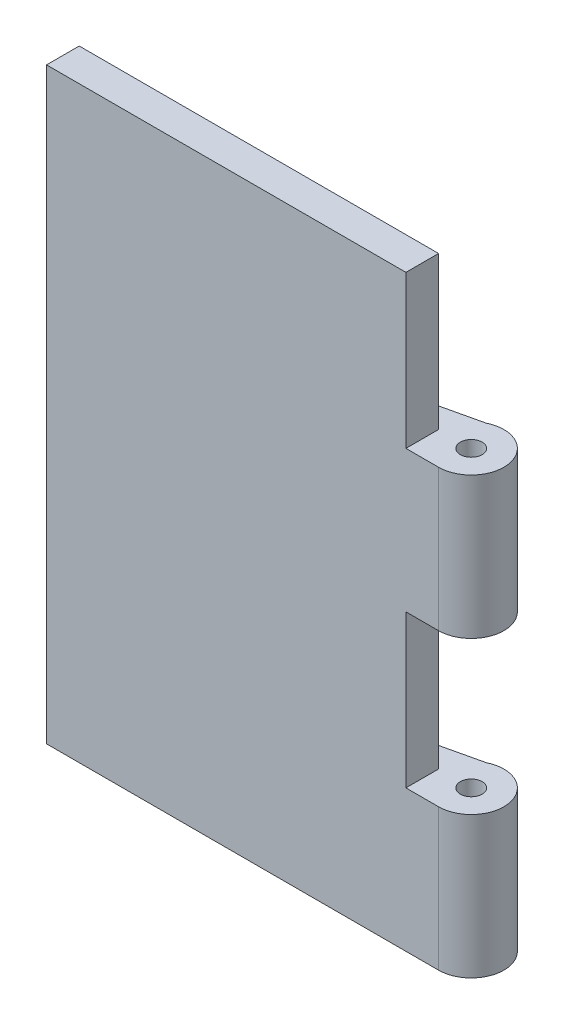
ISO-10303-21;
HEADER;
FILE_DESCRIPTION(('STEP AP214'),'2;1');
FILE_NAME('part.step','',(''),(''),'','','');
FILE_SCHEMA(('AUTOMOTIVE_DESIGN { 1 0 10303 214 1 1 1 1 }'));
ENDSEC;
DATA;
#1=APPLICATION_CONTEXT('core data for automotive mechanical design processes');
#2=APPLICATION_PROTOCOL_DEFINITION('international standard','automotive_design',2000,#1);
#3=PRODUCT_CONTEXT('',#1,'mechanical');
#4=PRODUCT('Part','Part','',(#3));
#5=PRODUCT_RELATED_PRODUCT_CATEGORY('part','',(#4));
#6=PRODUCT_DEFINITION_FORMATION('','',#4);
#7=PRODUCT_DEFINITION_CONTEXT('part definition',#1,'design');
#8=PRODUCT_DEFINITION('design','',#6,#7);
#9=PRODUCT_DEFINITION_SHAPE('','',#8);
#10=(LENGTH_UNIT() NAMED_UNIT(*) SI_UNIT(.MILLI.,.METRE.));
#11=(NAMED_UNIT(*) PLANE_ANGLE_UNIT() SI_UNIT($,.RADIAN.));
#12=(NAMED_UNIT(*) SI_UNIT($,.STERADIAN.) SOLID_ANGLE_UNIT());
#13=UNCERTAINTY_MEASURE_WITH_UNIT(LENGTH_MEASURE(1.E-05),#10,'distance_accuracy_value','');
#14=(GEOMETRIC_REPRESENTATION_CONTEXT(3) GLOBAL_UNCERTAINTY_ASSIGNED_CONTEXT((#13)) GLOBAL_UNIT_ASSIGNED_CONTEXT((#10,
#11,#12)) REPRESENTATION_CONTEXT('',''));
#15=CARTESIAN_POINT('',(0.,0.,0.));
#16=DIRECTION('',(0.,0.,1.));
#17=DIRECTION('',(1.,0.,0.));
#18=AXIS2_PLACEMENT_3D('',#15,#16,#17);
#19=CARTESIAN_POINT('',(-0.0379213483146069,6.5,-0.16432584269663));
#20=DIRECTION('',(0.224859506698759,0.,0.97439119569462));
#21=DIRECTION('',(0.97439119569462,0.,-0.224859506698759));
#22=AXIS2_PLACEMENT_3D('',#19,#20,#21);
#23=PLANE('',#22);
#24=DIRECTION('',(-0.97439119569462,0.,0.224859506698759));
#25=VECTOR('',#24,1.);
#26=CARTESIAN_POINT('',(-0.0379213483146069,0.,-0.16432584269663));
#27=LINE('',#26,#25);
#28=CARTESIAN_POINT('',(8.34269662921347,0.,-2.09831460674157));
#29=VERTEX_POINT('',#28);
#30=CARTESIAN_POINT('',(2.49999999999999,0.,-0.75));
#31=VERTEX_POINT('',#30);
#32=EDGE_CURVE('E160',#29,#31,#27,.T.);
#33=ORIENTED_EDGE('',*,*,#32,.T.);
#34=DIRECTION('',(0.,-1.,0.));
#35=VECTOR('',#34,1.);
#36=CARTESIAN_POINT('',(2.49999999999999,6.5,-0.75));
#37=LINE('',#36,#35);
#38=CARTESIAN_POINT('',(2.49999999999999,6.5,-0.75));
#39=VERTEX_POINT('',#38);
#40=EDGE_CURVE('E65',#39,#31,#37,.T.);
#41=ORIENTED_EDGE('',*,*,#40,.F.);
#42=DIRECTION('',(-0.97439119569462,0.,0.224859506698759));
#43=VECTOR('',#42,1.);
#44=CARTESIAN_POINT('',(-0.0379213483146069,6.5,-0.16432584269663));
#45=LINE('',#44,#43);
#46=CARTESIAN_POINT('',(8.34269662921347,6.5,-2.09831460674157));
#47=VERTEX_POINT('',#46);
#48=EDGE_CURVE('E241',#47,#39,#45,.T.);
#49=ORIENTED_EDGE('',*,*,#48,.F.);
#50=DIRECTION('',(0.,-1.,0.));
#51=VECTOR('',#50,1.);
#52=CARTESIAN_POINT('',(8.34269662921347,6.5,-2.09831460674157));
#53=LINE('',#52,#51);
#54=EDGE_CURVE('E12',#47,#29,#53,.T.);
#55=ORIENTED_EDGE('',*,*,#54,.T.);
#56=EDGE_LOOP('',(#33,#41,#49,#55));
#57=FACE_BOUND('',#56,.T.);
#58=ADVANCED_FACE('F56',(#57),#23,.F.);
#59=CARTESIAN_POINT('',(0.,6.5,-0.749999999999999));
#60=DIRECTION('',(0.,0.,1.));
#61=DIRECTION('',(1.,0.,0.));
#62=AXIS2_PLACEMENT_3D('',#59,#60,#61);
#63=PLANE('',#62);
#64=DIRECTION('',(-1.,0.,0.));
#65=VECTOR('',#64,1.);
#66=CARTESIAN_POINT('',(0.,0.,-0.749999999999999));
#67=LINE('',#66,#65);
#68=CARTESIAN_POINT('',(-9.00000000000001,0.,-0.749999999999997));
#69=VERTEX_POINT('',#68);
#70=EDGE_CURVE('E149',#31,#69,#67,.T.);
#71=ORIENTED_EDGE('',*,*,#70,.T.);
#72=DIRECTION('',(0.,-1.,0.));
#73=VECTOR('',#72,1.);
#74=CARTESIAN_POINT('',(-9.00000000000001,27.,-0.749999999999997));
#75=LINE('',#74,#73);
#76=CARTESIAN_POINT('',(-9.00000000000001,27.,-0.749999999999997));
#77=VERTEX_POINT('',#76);
#78=EDGE_CURVE('E154',#77,#69,#75,.T.);
#79=ORIENTED_EDGE('',*,*,#78,.F.);
#80=DIRECTION('',(-1.,0.,0.));
#81=VECTOR('',#80,1.);
#82=CARTESIAN_POINT('',(7.50000000000001,27.,-0.749999999999997));
#83=LINE('',#82,#81);
#84=CARTESIAN_POINT('',(7.50000000000001,27.,-0.749999999999997));
#85=VERTEX_POINT('',#84);
#86=EDGE_CURVE('E194',#85,#77,#83,.T.);
#87=ORIENTED_EDGE('',*,*,#86,.F.);
#88=DIRECTION('',(0.,-1.,0.));
#89=VECTOR('',#88,1.);
#90=CARTESIAN_POINT('',(7.50000000000001,27.,-0.749999999999997));
#91=LINE('',#90,#89);
#92=CARTESIAN_POINT('',(7.50000000000001,20.,-0.749999999999997));
#93=VERTEX_POINT('',#92);
#94=EDGE_CURVE('E196',#85,#93,#91,.T.);
#95=ORIENTED_EDGE('',*,*,#94,.T.);
#96=DIRECTION('',(-1.,0.,0.));
#97=VECTOR('',#96,1.);
#98=CARTESIAN_POINT('',(7.50000000000001,20.,-0.749999999999997));
#99=LINE('',#98,#97);
#100=CARTESIAN_POINT('',(2.5,20.,-0.749999999999997));
#101=VERTEX_POINT('',#100);
#102=EDGE_CURVE('E192',#93,#101,#99,.T.);
#103=ORIENTED_EDGE('',*,*,#102,.T.);
#104=DIRECTION('',(0.,-1.,0.));
#105=VECTOR('',#104,1.);
#106=CARTESIAN_POINT('',(2.5,20.,-0.749999999999997));
#107=LINE('',#106,#105);
#108=CARTESIAN_POINT('',(2.50000000000005,13.5,-0.750000000000003));
#109=VERTEX_POINT('',#108);
#110=EDGE_CURVE('E214',#101,#109,#107,.T.);
#111=ORIENTED_EDGE('',*,*,#110,.T.);
#112=DIRECTION('',(-1.,0.,0.));
#113=VECTOR('',#112,1.);
#114=CARTESIAN_POINT('',(7.50000000000001,13.5,-0.749999999999997));
#115=LINE('',#114,#113);
#116=CARTESIAN_POINT('',(7.50000000000001,13.5,-0.749999999999997));
#117=VERTEX_POINT('',#116);
#118=EDGE_CURVE('E81',#117,#109,#115,.T.);
#119=ORIENTED_EDGE('',*,*,#118,.F.);
#120=DIRECTION('',(0.,-1.,0.));
#121=VECTOR('',#120,1.);
#122=CARTESIAN_POINT('',(7.50000000000001,13.5,-0.749999999999997));
#123=LINE('',#122,#121);
#124=CARTESIAN_POINT('',(7.50000000000001,6.5,-0.749999999999997));
#125=VERTEX_POINT('',#124);
#126=EDGE_CURVE('E231',#117,#125,#123,.T.);
#127=ORIENTED_EDGE('',*,*,#126,.T.);
#128=DIRECTION('',(-1.,0.,0.));
#129=VECTOR('',#128,1.);
#130=CARTESIAN_POINT('',(7.50000000000001,6.5,-0.749999999999997));
#131=LINE('',#130,#129);
#132=EDGE_CURVE('E229',#125,#39,#131,.T.);
#133=ORIENTED_EDGE('',*,*,#132,.T.);
#134=ORIENTED_EDGE('',*,*,#40,.T.);
#135=EDGE_LOOP('',(#71,#79,#87,#95,#103,#111,#119,#127,#133,#134));
#136=FACE_BOUND('',#135,.T.);
#137=ADVANCED_FACE('F151',(#136),#63,.F.);
#138=CARTESIAN_POINT('',(0.,6.5,0.750000000000001));
#139=DIRECTION('',(0.,0.,1.));
#140=DIRECTION('',(1.,0.,0.));
#141=AXIS2_PLACEMENT_3D('',#138,#139,#140);
#142=PLANE('',#141);
#143=DIRECTION('',(-1.,0.,0.));
#144=VECTOR('',#143,1.);
#145=CARTESIAN_POINT('',(0.,0.,0.750000000000001));
#146=LINE('',#145,#144);
#147=CARTESIAN_POINT('',(8.99999999999999,0.,0.750000000000002));
#148=VERTEX_POINT('',#147);
#149=CARTESIAN_POINT('',(-9.00000000000001,0.,0.750000000000004));
#150=VERTEX_POINT('',#149);
#151=EDGE_CURVE('E159',#148,#150,#146,.T.);
#152=ORIENTED_EDGE('',*,*,#151,.F.);
#153=DIRECTION('',(0.,-1.,0.));
#154=VECTOR('',#153,1.);
#155=CARTESIAN_POINT('',(8.99999999999999,6.5,0.750000000000002));
#156=LINE('',#155,#154);
#157=CARTESIAN_POINT('',(8.99999999999999,6.5,0.750000000000002));
#158=VERTEX_POINT('',#157);
#159=EDGE_CURVE('E246',#158,#148,#156,.T.);
#160=ORIENTED_EDGE('',*,*,#159,.F.);
#161=DIRECTION('',(-1.,0.,0.));
#162=VECTOR('',#161,1.);
#163=CARTESIAN_POINT('',(0.,6.5,0.750000000000001));
#164=LINE('',#163,#162);
#165=CARTESIAN_POINT('',(7.50000000000001,6.5,0.749999999999997));
#166=VERTEX_POINT('',#165);
#167=EDGE_CURVE('E243',#158,#166,#164,.T.);
#168=ORIENTED_EDGE('',*,*,#167,.T.);
#169=DIRECTION('',(0.,-1.,0.));
#170=VECTOR('',#169,1.);
#171=CARTESIAN_POINT('',(7.50000000000001,13.5,0.749999999999997));
#172=LINE('',#171,#170);
#173=CARTESIAN_POINT('',(7.50000000000001,13.5,0.749999999999997));
#174=VERTEX_POINT('',#173);
#175=EDGE_CURVE('E237',#174,#166,#172,.T.);
#176=ORIENTED_EDGE('',*,*,#175,.F.);
#177=DIRECTION('',(1.,0.,0.));
#178=VECTOR('',#177,1.);
#179=CARTESIAN_POINT('',(0.,13.5,0.749999999999997));
#180=LINE('',#179,#178);
#181=CARTESIAN_POINT('',(8.99999999999999,13.5,0.749999999999978));
#182=VERTEX_POINT('',#181);
#183=EDGE_CURVE('E205',#174,#182,#180,.T.);
#184=ORIENTED_EDGE('',*,*,#183,.T.);
#185=DIRECTION('',(0.,-1.,0.));
#186=VECTOR('',#185,1.);
#187=CARTESIAN_POINT('',(8.99999999999999,20.,0.749999999999978));
#188=LINE('',#187,#186);
#189=CARTESIAN_POINT('',(8.99999999999999,20.,0.749999999999978));
#190=VERTEX_POINT('',#189);
#191=EDGE_CURVE('E223',#190,#182,#188,.T.);
#192=ORIENTED_EDGE('',*,*,#191,.F.);
#193=DIRECTION('',(1.,0.,0.));
#194=VECTOR('',#193,1.);
#195=CARTESIAN_POINT('',(0.,20.,0.749999999999997));
#196=LINE('',#195,#194);
#197=CARTESIAN_POINT('',(7.50000000000001,20.,0.749999999999997));
#198=VERTEX_POINT('',#197);
#199=EDGE_CURVE('E206',#198,#190,#196,.T.);
#200=ORIENTED_EDGE('',*,*,#199,.F.);
#201=DIRECTION('',(0.,-1.,0.));
#202=VECTOR('',#201,1.);
#203=CARTESIAN_POINT('',(7.50000000000001,27.,0.749999999999997));
#204=LINE('',#203,#202);
#205=CARTESIAN_POINT('',(7.50000000000001,27.,0.749999999999997));
#206=VERTEX_POINT('',#205);
#207=EDGE_CURVE('E202',#206,#198,#204,.T.);
#208=ORIENTED_EDGE('',*,*,#207,.F.);
#209=DIRECTION('',(1.,0.,0.));
#210=VECTOR('',#209,1.);
#211=CARTESIAN_POINT('',(7.50000000000001,27.,0.749999999999997));
#212=LINE('',#211,#210);
#213=CARTESIAN_POINT('',(-9.00000000000001,27.,0.750000000000004));
#214=VERTEX_POINT('',#213);
#215=EDGE_CURVE('E189',#214,#206,#212,.T.);
#216=ORIENTED_EDGE('',*,*,#215,.F.);
#217=DIRECTION('',(0.,1.,0.));
#218=VECTOR('',#217,1.);
#219=CARTESIAN_POINT('',(-9.00000000000001,27.,0.750000000000004));
#220=LINE('',#219,#218);
#221=EDGE_CURVE('E170',#150,#214,#220,.T.);
#222=ORIENTED_EDGE('',*,*,#221,.F.);
#223=EDGE_LOOP('',(#152,#160,#168,#176,#184,#192,#200,#208,#216,#222));
#224=FACE_BOUND('',#223,.T.);
#225=ADVANCED_FACE('F262',(#224),#142,.T.);
#226=CARTESIAN_POINT('',(0.,0.,0.));
#227=DIRECTION('',(0.,1.,0.));
#228=DIRECTION('',(0.,0.,1.));
#229=AXIS2_PLACEMENT_3D('',#226,#227,#228);
#230=PLANE('',#229);
#231=CARTESIAN_POINT('',(8.99999999999999,0.,-0.749999999999997));
#232=DIRECTION('',(0.,-1.,0.));
#233=DIRECTION('',(0.,0.,-1.));
#234=AXIS2_PLACEMENT_3D('',#231,#232,#233);
#235=CIRCLE('',#234,0.500000000000001);
#236=CARTESIAN_POINT('',(8.99999999999999,0.,-1.25));
#237=VERTEX_POINT('',#236);
#238=EDGE_CURVE('E180',#237,#237,#235,.T.);
#239=ORIENTED_EDGE('',*,*,#238,.F.);
#240=EDGE_LOOP('',(#239));
#241=FACE_BOUND('',#240,.T.);
#242=ORIENTED_EDGE('',*,*,#32,.F.);
#243=CARTESIAN_POINT('',(8.99999999999999,0.,-0.749999999999999));
#244=DIRECTION('',(0.,1.,0.));
#245=DIRECTION('',(0.,0.,1.));
#246=AXIS2_PLACEMENT_3D('',#243,#244,#245);
#247=CIRCLE('',#246,1.5);
#248=EDGE_CURVE('E240',#148,#29,#247,.T.);
#249=ORIENTED_EDGE('',*,*,#248,.F.);
#250=ORIENTED_EDGE('',*,*,#151,.T.);
#251=DIRECTION('',(0.,0.,1.));
#252=VECTOR('',#251,1.);
#253=CARTESIAN_POINT('',(-9.00000000000001,0.,-0.749999999999997));
#254=LINE('',#253,#252);
#255=EDGE_CURVE('E163',#69,#150,#254,.T.);
#256=ORIENTED_EDGE('',*,*,#255,.F.);
#257=ORIENTED_EDGE('',*,*,#70,.F.);
#258=EDGE_LOOP('',(#242,#249,#250,#256,#257));
#259=FACE_BOUND('',#258,.T.);
#260=ADVANCED_FACE('F164',(#241,#259),#230,.F.);
#261=CARTESIAN_POINT('',(0.,6.5,0.));
#262=DIRECTION('',(0.,1.,0.));
#263=DIRECTION('',(0.,0.,1.));
#264=AXIS2_PLACEMENT_3D('',#261,#262,#263);
#265=PLANE('',#264);
#266=CARTESIAN_POINT('',(8.99999999999999,6.5,-0.749999999999997));
#267=DIRECTION('',(0.,1.,0.));
#268=DIRECTION('',(0.,0.,1.));
#269=AXIS2_PLACEMENT_3D('',#266,#267,#268);
#270=CIRCLE('',#269,0.500000000000001);
#271=CARTESIAN_POINT('',(8.99999999999999,6.5,-0.249999999999996));
#272=VERTEX_POINT('',#271);
#273=EDGE_CURVE('E186',#272,#272,#270,.T.);
#274=ORIENTED_EDGE('',*,*,#273,.F.);
#275=EDGE_LOOP('',(#274));
#276=FACE_BOUND('',#275,.T.);
#277=ORIENTED_EDGE('',*,*,#132,.F.);
#278=DIRECTION('',(0.,0.,-1.));
#279=VECTOR('',#278,1.);
#280=CARTESIAN_POINT('',(7.50000000000001,6.5,0.749999999999997));
#281=LINE('',#280,#279);
#282=EDGE_CURVE('E226',#166,#125,#281,.T.);
#283=ORIENTED_EDGE('',*,*,#282,.F.);
#284=ORIENTED_EDGE('',*,*,#167,.F.);
#285=CARTESIAN_POINT('',(8.99999999999999,6.5,-0.749999999999999));
#286=DIRECTION('',(0.,1.,0.));
#287=DIRECTION('',(0.,0.,1.));
#288=AXIS2_PLACEMENT_3D('',#285,#286,#287);
#289=CIRCLE('',#288,1.5);
#290=EDGE_CURVE('E247',#158,#47,#289,.T.);
#291=ORIENTED_EDGE('',*,*,#290,.T.);
#292=ORIENTED_EDGE('',*,*,#48,.T.);
#293=EDGE_LOOP('',(#277,#283,#284,#291,#292));
#294=FACE_BOUND('',#293,.T.);
#295=ADVANCED_FACE('F259',(#276,#294),#265,.T.);
#296=CARTESIAN_POINT('',(8.99999999999999,6.5,-0.749999999999999));
#297=DIRECTION('',(0.,-1.,0.));
#298=DIRECTION('',(0.,0.,-1.));
#299=AXIS2_PLACEMENT_3D('',#296,#297,#298);
#300=CYLINDRICAL_SURFACE('',#299,1.5);
#301=ORIENTED_EDGE('',*,*,#248,.T.);
#302=ORIENTED_EDGE('',*,*,#54,.F.);
#303=ORIENTED_EDGE('',*,*,#290,.F.);
#304=ORIENTED_EDGE('',*,*,#159,.T.);
#305=EDGE_LOOP('',(#301,#302,#303,#304));
#306=FACE_BOUND('',#305,.T.);
#307=ADVANCED_FACE('F58',(#306),#300,.T.);
#308=CARTESIAN_POINT('',(7.50000000000001,13.5,0.749999999999997));
#309=DIRECTION('',(-1.,0.,0.));
#310=DIRECTION('',(0.,0.,1.));
#311=AXIS2_PLACEMENT_3D('',#308,#309,#310);
#312=PLANE('',#311);
#313=ORIENTED_EDGE('',*,*,#282,.T.);
#314=ORIENTED_EDGE('',*,*,#126,.F.);
#315=DIRECTION('',(0.,0.,-1.));
#316=VECTOR('',#315,1.);
#317=CARTESIAN_POINT('',(7.50000000000001,13.5,0.749999999999997));
#318=LINE('',#317,#316);
#319=EDGE_CURVE('E227',#174,#117,#318,.T.);
#320=ORIENTED_EDGE('',*,*,#319,.F.);
#321=ORIENTED_EDGE('',*,*,#175,.T.);
#322=EDGE_LOOP('',(#313,#314,#320,#321));
#323=FACE_BOUND('',#322,.T.);
#324=ADVANCED_FACE('F265',(#323),#312,.F.);
#325=CARTESIAN_POINT('',(0.,13.5,0.));
#326=DIRECTION('',(0.,1.,0.));
#327=DIRECTION('',(0.,0.,1.));
#328=AXIS2_PLACEMENT_3D('',#325,#326,#327);
#329=PLANE('',#328);
#330=CARTESIAN_POINT('',(8.99999999999999,13.5,-0.749999999999997));
#331=DIRECTION('',(0.,1.,0.));
#332=DIRECTION('',(0.,0.,1.));
#333=AXIS2_PLACEMENT_3D('',#330,#331,#332);
#334=CIRCLE('',#333,0.500000000000001);
#335=CARTESIAN_POINT('',(8.99999999999999,13.5,-0.249999999999996));
#336=VERTEX_POINT('',#335);
#337=EDGE_CURVE('E183',#336,#336,#334,.T.);
#338=ORIENTED_EDGE('',*,*,#337,.T.);
#339=EDGE_LOOP('',(#338));
#340=FACE_BOUND('',#339,.T.);
#341=ORIENTED_EDGE('',*,*,#183,.F.);
#342=ORIENTED_EDGE('',*,*,#319,.T.);
#343=ORIENTED_EDGE('',*,*,#118,.T.);
#344=DIRECTION('',(0.974391195694621,0.,-0.224859506698756));
#345=VECTOR('',#344,1.);
#346=CARTESIAN_POINT('',(-0.0379213483146073,13.5,-0.164325842696634));
#347=LINE('',#346,#345);
#348=CARTESIAN_POINT('',(8.34269662921349,13.5,-2.09831460674156));
#349=VERTEX_POINT('',#348);
#350=EDGE_CURVE('E209',#109,#349,#347,.T.);
#351=ORIENTED_EDGE('',*,*,#350,.T.);
#352=CARTESIAN_POINT('',(8.99999999999999,13.5,-0.749999999999999));
#353=DIRECTION('',(0.,1.,0.));
#354=DIRECTION('',(0.,0.,1.));
#355=AXIS2_PLACEMENT_3D('',#352,#353,#354);
#356=CIRCLE('',#355,1.49999999999998);
#357=EDGE_CURVE('E216',#182,#349,#356,.T.);
#358=ORIENTED_EDGE('',*,*,#357,.F.);
#359=EDGE_LOOP('',(#341,#342,#343,#351,#358));
#360=FACE_BOUND('',#359,.T.);
#361=ADVANCED_FACE('F268',(#340,#360),#329,.F.);
#362=CARTESIAN_POINT('',(8.99999999999999,20.,-0.749999999999999));
#363=DIRECTION('',(0.,-1.,0.));
#364=DIRECTION('',(0.,0.,-1.));
#365=AXIS2_PLACEMENT_3D('',#362,#363,#364);
#366=CYLINDRICAL_SURFACE('',#365,1.49999999999998);
#367=ORIENTED_EDGE('',*,*,#357,.T.);
#368=DIRECTION('',(0.,-1.,0.));
#369=VECTOR('',#368,1.);
#370=CARTESIAN_POINT('',(8.34269662921349,20.,-2.09831460674156));
#371=LINE('',#370,#369);
#372=CARTESIAN_POINT('',(8.34269662921349,20.,-2.09831460674156));
#373=VERTEX_POINT('',#372);
#374=EDGE_CURVE('E221',#373,#349,#371,.T.);
#375=ORIENTED_EDGE('',*,*,#374,.F.);
#376=CARTESIAN_POINT('',(8.99999999999999,20.,-0.749999999999999));
#377=DIRECTION('',(0.,1.,0.));
#378=DIRECTION('',(0.,0.,1.));
#379=AXIS2_PLACEMENT_3D('',#376,#377,#378);
#380=CIRCLE('',#379,1.49999999999998);
#381=EDGE_CURVE('E208',#190,#373,#380,.T.);
#382=ORIENTED_EDGE('',*,*,#381,.F.);
#383=ORIENTED_EDGE('',*,*,#191,.T.);
#384=EDGE_LOOP('',(#367,#375,#382,#383));
#385=FACE_BOUND('',#384,.T.);
#386=ADVANCED_FACE('F272',(#385),#366,.T.);
#387=CARTESIAN_POINT('',(-0.0379213483146073,20.,-0.164325842696634));
#388=DIRECTION('',(-0.224859506698756,0.,-0.974391195694621));
#389=DIRECTION('',(-0.974391195694621,0.,0.224859506698756));
#390=AXIS2_PLACEMENT_3D('',#387,#388,#389);
#391=PLANE('',#390);
#392=ORIENTED_EDGE('',*,*,#350,.F.);
#393=ORIENTED_EDGE('',*,*,#110,.F.);
#394=DIRECTION('',(0.974391195694621,0.,-0.224859506698756));
#395=VECTOR('',#394,1.);
#396=CARTESIAN_POINT('',(-0.0379213483146073,20.,-0.164325842696634));
#397=LINE('',#396,#395);
#398=EDGE_CURVE('E211',#101,#373,#397,.T.);
#399=ORIENTED_EDGE('',*,*,#398,.T.);
#400=ORIENTED_EDGE('',*,*,#374,.T.);
#401=EDGE_LOOP('',(#392,#393,#399,#400));
#402=FACE_BOUND('',#401,.T.);
#403=ADVANCED_FACE('F285',(#402),#391,.T.);
#404=CARTESIAN_POINT('',(0.,20.,0.));
#405=DIRECTION('',(0.,1.,0.));
#406=DIRECTION('',(0.,0.,1.));
#407=AXIS2_PLACEMENT_3D('',#404,#405,#406);
#408=PLANE('',#407);
#409=CARTESIAN_POINT('',(8.99999999999999,20.,-0.749999999999997));
#410=DIRECTION('',(0.,1.,0.));
#411=DIRECTION('',(0.,0.,1.));
#412=AXIS2_PLACEMENT_3D('',#409,#410,#411);
#413=CIRCLE('',#412,0.500000000000001);
#414=CARTESIAN_POINT('',(8.99999999999999,20.,-0.249999999999996));
#415=VERTEX_POINT('',#414);
#416=EDGE_CURVE('E60',#415,#415,#413,.T.);
#417=ORIENTED_EDGE('',*,*,#416,.F.);
#418=EDGE_LOOP('',(#417));
#419=FACE_BOUND('',#418,.T.);
#420=ORIENTED_EDGE('',*,*,#102,.F.);
#421=DIRECTION('',(0.,0.,-1.));
#422=VECTOR('',#421,1.);
#423=CARTESIAN_POINT('',(7.50000000000001,20.,0.749999999999997));
#424=LINE('',#423,#422);
#425=EDGE_CURVE('E73',#198,#93,#424,.T.);
#426=ORIENTED_EDGE('',*,*,#425,.F.);
#427=ORIENTED_EDGE('',*,*,#199,.T.);
#428=ORIENTED_EDGE('',*,*,#381,.T.);
#429=ORIENTED_EDGE('',*,*,#398,.F.);
#430=EDGE_LOOP('',(#420,#426,#427,#428,#429));
#431=FACE_BOUND('',#430,.T.);
#432=ADVANCED_FACE('F275',(#419,#431),#408,.T.);
#433=CARTESIAN_POINT('',(7.50000000000001,27.,0.749999999999997));
#434=DIRECTION('',(-1.,0.,0.));
#435=DIRECTION('',(0.,0.,1.));
#436=AXIS2_PLACEMENT_3D('',#433,#434,#435);
#437=PLANE('',#436);
#438=ORIENTED_EDGE('',*,*,#425,.T.);
#439=ORIENTED_EDGE('',*,*,#94,.F.);
#440=DIRECTION('',(0.,0.,-1.));
#441=VECTOR('',#440,1.);
#442=CARTESIAN_POINT('',(7.50000000000001,27.,0.749999999999997));
#443=LINE('',#442,#441);
#444=EDGE_CURVE('E191',#206,#85,#443,.T.);
#445=ORIENTED_EDGE('',*,*,#444,.F.);
#446=ORIENTED_EDGE('',*,*,#207,.T.);
#447=EDGE_LOOP('',(#438,#439,#445,#446));
#448=FACE_BOUND('',#447,.T.);
#449=ADVANCED_FACE('F279',(#448),#437,.F.);
#450=CARTESIAN_POINT('',(0.,27.,0.));
#451=DIRECTION('',(0.,1.,0.));
#452=DIRECTION('',(0.,0.,1.));
#453=AXIS2_PLACEMENT_3D('',#450,#451,#452);
#454=PLANE('',#453);
#455=ORIENTED_EDGE('',*,*,#86,.T.);
#456=DIRECTION('',(0.,0.,-1.));
#457=VECTOR('',#456,1.);
#458=CARTESIAN_POINT('',(-9.00000000000001,27.,-0.749999999999997));
#459=LINE('',#458,#457);
#460=EDGE_CURVE('E175',#214,#77,#459,.T.);
#461=ORIENTED_EDGE('',*,*,#460,.F.);
#462=ORIENTED_EDGE('',*,*,#215,.T.);
#463=ORIENTED_EDGE('',*,*,#444,.T.);
#464=EDGE_LOOP('',(#455,#461,#462,#463));
#465=FACE_BOUND('',#464,.T.);
#466=ADVANCED_FACE('F282',(#465),#454,.T.);
#467=CARTESIAN_POINT('',(8.99999999999999,27.,-0.749999999999997));
#468=DIRECTION('',(0.,-1.,0.));
#469=DIRECTION('',(0.,0.,-1.));
#470=AXIS2_PLACEMENT_3D('',#467,#468,#469);
#471=CYLINDRICAL_SURFACE('',#470,0.500000000000001);
#472=ORIENTED_EDGE('',*,*,#416,.T.);
#473=EDGE_LOOP('',(#472));
#474=FACE_BOUND('',#473,.T.);
#475=ORIENTED_EDGE('',*,*,#337,.F.);
#476=EDGE_LOOP('',(#475));
#477=FACE_BOUND('',#476,.T.);
#478=ADVANCED_FACE('F348',(#474,#477),#471,.F.);
#479=ORIENTED_EDGE('',*,*,#273,.T.);
#480=EDGE_LOOP('',(#479));
#481=FACE_BOUND('',#480,.T.);
#482=ORIENTED_EDGE('',*,*,#238,.T.);
#483=EDGE_LOOP('',(#482));
#484=FACE_BOUND('',#483,.T.);
#485=ADVANCED_FACE('F344',(#481,#484),#471,.F.);
#486=CARTESIAN_POINT('',(-9.00000000000001,0.,0.));
#487=DIRECTION('',(-1.,0.,0.));
#488=DIRECTION('',(0.,0.,1.));
#489=AXIS2_PLACEMENT_3D('',#486,#487,#488);
#490=PLANE('',#489);
#491=ORIENTED_EDGE('',*,*,#78,.T.);
#492=ORIENTED_EDGE('',*,*,#255,.T.);
#493=ORIENTED_EDGE('',*,*,#221,.T.);
#494=ORIENTED_EDGE('',*,*,#460,.T.);
#495=EDGE_LOOP('',(#491,#492,#493,#494));
#496=FACE_BOUND('',#495,.T.);
#497=ADVANCED_FACE('F173',(#496),#490,.T.);
#498=CLOSED_SHELL('',(#58,#137,#225,#260,#295,#307,#324,#361,#386,#403,#432,#449,#466,#478,#485,#497));
#499=MANIFOLD_SOLID_BREP('B2',#498);
#500=ADVANCED_BREP_SHAPE_REPRESENTATION('',(#18,#499),#14);
#501=SHAPE_DEFINITION_REPRESENTATION(#9,#500);
ENDSEC;
END-ISO-10303-21;
